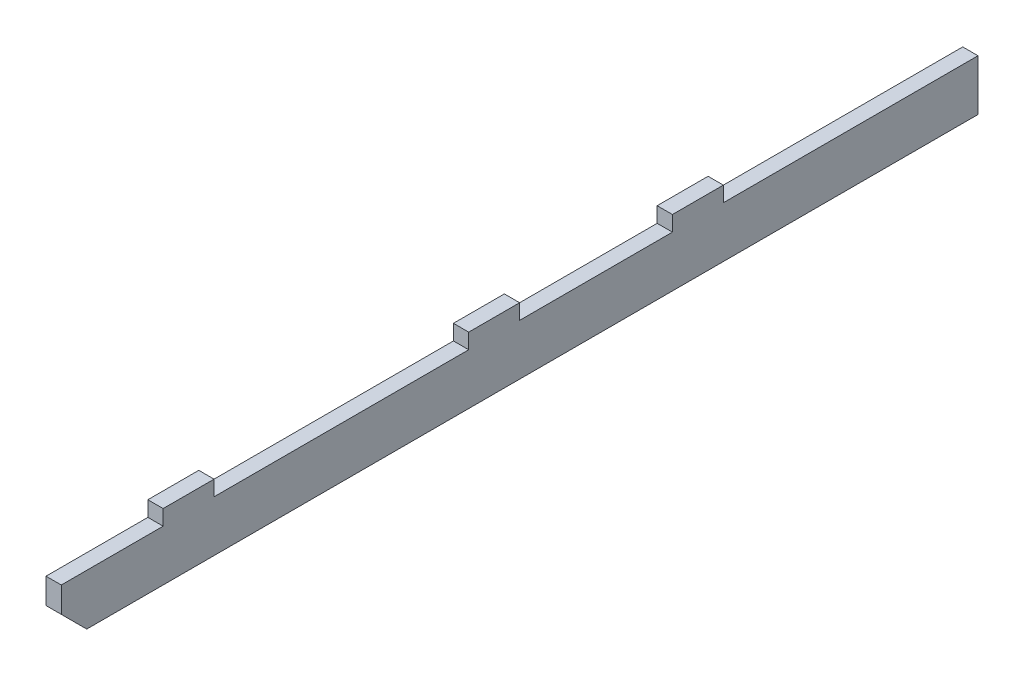
ISO-10303-21;
HEADER;
FILE_DESCRIPTION(('STEP AP214'),'2;1');
FILE_NAME('part.step','',(''),(''),'','','');
FILE_SCHEMA(('AUTOMOTIVE_DESIGN { 1 0 10303 214 1 1 1 1 }'));
ENDSEC;
DATA;
#1=APPLICATION_CONTEXT('core data for automotive mechanical design processes');
#2=APPLICATION_PROTOCOL_DEFINITION('international standard','automotive_design',2000,#1);
#3=PRODUCT_CONTEXT('',#1,'mechanical');
#4=PRODUCT('Part','Part','',(#3));
#5=PRODUCT_RELATED_PRODUCT_CATEGORY('part','',(#4));
#6=PRODUCT_DEFINITION_FORMATION('','',#4);
#7=PRODUCT_DEFINITION_CONTEXT('part definition',#1,'design');
#8=PRODUCT_DEFINITION('design','',#6,#7);
#9=PRODUCT_DEFINITION_SHAPE('','',#8);
#10=(LENGTH_UNIT() NAMED_UNIT(*) SI_UNIT(.MILLI.,.METRE.));
#11=(NAMED_UNIT(*) PLANE_ANGLE_UNIT() SI_UNIT($,.RADIAN.));
#12=(NAMED_UNIT(*) SI_UNIT($,.STERADIAN.) SOLID_ANGLE_UNIT());
#13=UNCERTAINTY_MEASURE_WITH_UNIT(LENGTH_MEASURE(1.E-05),#10,'distance_accuracy_value','');
#14=(GEOMETRIC_REPRESENTATION_CONTEXT(3) GLOBAL_UNCERTAINTY_ASSIGNED_CONTEXT((#13)) GLOBAL_UNIT_ASSIGNED_CONTEXT((#10,
#11,#12)) REPRESENTATION_CONTEXT('',''));
#15=CARTESIAN_POINT('',(0.,0.,0.));
#16=DIRECTION('',(0.,0.,1.));
#17=DIRECTION('',(1.,0.,0.));
#18=AXIS2_PLACEMENT_3D('',#15,#16,#17);
#19=CARTESIAN_POINT('',(3.,5.,-90.));
#20=DIRECTION('',(0.,0.,1.));
#21=DIRECTION('',(1.,0.,0.));
#22=AXIS2_PLACEMENT_3D('',#19,#20,#21);
#23=PLANE('',#22);
#24=DIRECTION('',(0.,1.,0.));
#25=VECTOR('',#24,1.);
#26=CARTESIAN_POINT('',(0.,5.,-90.));
#27=LINE('',#26,#25);
#28=CARTESIAN_POINT('',(0.,-5.,-90.));
#29=VERTEX_POINT('',#28);
#30=CARTESIAN_POINT('',(0.,5.,-90.));
#31=VERTEX_POINT('',#30);
#32=EDGE_CURVE('E180',#29,#31,#27,.T.);
#33=ORIENTED_EDGE('',*,*,#32,.T.);
#34=DIRECTION('',(-1.,0.,0.));
#35=VECTOR('',#34,1.);
#36=CARTESIAN_POINT('',(3.,5.,-90.));
#37=LINE('',#36,#35);
#38=CARTESIAN_POINT('',(3.,5.,-90.));
#39=VERTEX_POINT('',#38);
#40=EDGE_CURVE('E161',#39,#31,#37,.T.);
#41=ORIENTED_EDGE('',*,*,#40,.F.);
#42=DIRECTION('',(0.,1.,0.));
#43=VECTOR('',#42,1.);
#44=CARTESIAN_POINT('',(3.,5.,-90.));
#45=LINE('',#44,#43);
#46=CARTESIAN_POINT('',(3.,-5.,-90.));
#47=VERTEX_POINT('',#46);
#48=EDGE_CURVE('E168',#47,#39,#45,.T.);
#49=ORIENTED_EDGE('',*,*,#48,.F.);
#50=DIRECTION('',(-1.,0.,0.));
#51=VECTOR('',#50,1.);
#52=CARTESIAN_POINT('',(3.,-5.,-90.));
#53=LINE('',#52,#51);
#54=EDGE_CURVE('E224',#47,#29,#53,.T.);
#55=ORIENTED_EDGE('',*,*,#54,.T.);
#56=EDGE_LOOP('',(#33,#41,#49,#55));
#57=FACE_BOUND('',#56,.T.);
#58=ADVANCED_FACE('F38',(#57),#23,.F.);
#59=CARTESIAN_POINT('',(3.,5.,-40.));
#60=DIRECTION('',(0.,-1.,0.));
#61=DIRECTION('',(0.,0.,-1.));
#62=AXIS2_PLACEMENT_3D('',#59,#60,#61);
#63=PLANE('',#62);
#64=DIRECTION('',(0.,0.,1.));
#65=VECTOR('',#64,1.);
#66=CARTESIAN_POINT('',(0.,5.,-40.));
#67=LINE('',#66,#65);
#68=CARTESIAN_POINT('',(0.,5.,-40.));
#69=VERTEX_POINT('',#68);
#70=EDGE_CURVE('E253',#31,#69,#67,.T.);
#71=ORIENTED_EDGE('',*,*,#70,.T.);
#72=DIRECTION('',(-1.,0.,0.));
#73=VECTOR('',#72,1.);
#74=CARTESIAN_POINT('',(3.,5.,-40.));
#75=LINE('',#74,#73);
#76=CARTESIAN_POINT('',(3.,5.,-40.));
#77=VERTEX_POINT('',#76);
#78=EDGE_CURVE('E164',#77,#69,#75,.T.);
#79=ORIENTED_EDGE('',*,*,#78,.F.);
#80=DIRECTION('',(0.,0.,1.));
#81=VECTOR('',#80,1.);
#82=CARTESIAN_POINT('',(3.,5.,-40.));
#83=LINE('',#82,#81);
#84=EDGE_CURVE('E157',#39,#77,#83,.T.);
#85=ORIENTED_EDGE('',*,*,#84,.F.);
#86=ORIENTED_EDGE('',*,*,#40,.T.);
#87=EDGE_LOOP('',(#71,#79,#85,#86));
#88=FACE_BOUND('',#87,.T.);
#89=ADVANCED_FACE('F159',(#88),#63,.F.);
#90=CARTESIAN_POINT('',(3.,5.,-40.));
#91=DIRECTION('',(0.,0.,1.));
#92=DIRECTION('',(1.,0.,0.));
#93=AXIS2_PLACEMENT_3D('',#90,#91,#92);
#94=PLANE('',#93);
#95=DIRECTION('',(0.,1.,0.));
#96=VECTOR('',#95,1.);
#97=CARTESIAN_POINT('',(0.,5.,-40.));
#98=LINE('',#97,#96);
#99=CARTESIAN_POINT('',(0.,8.,-40.));
#100=VERTEX_POINT('',#99);
#101=EDGE_CURVE('E251',#69,#100,#98,.T.);
#102=ORIENTED_EDGE('',*,*,#101,.T.);
#103=DIRECTION('',(-1.,0.,0.));
#104=VECTOR('',#103,1.);
#105=CARTESIAN_POINT('',(3.,8.,-40.));
#106=LINE('',#105,#104);
#107=CARTESIAN_POINT('',(3.,8.,-40.));
#108=VERTEX_POINT('',#107);
#109=EDGE_CURVE('E185',#108,#100,#106,.T.);
#110=ORIENTED_EDGE('',*,*,#109,.F.);
#111=DIRECTION('',(0.,1.,0.));
#112=VECTOR('',#111,1.);
#113=CARTESIAN_POINT('',(3.,5.,-40.));
#114=LINE('',#113,#112);
#115=EDGE_CURVE('E167',#77,#108,#114,.T.);
#116=ORIENTED_EDGE('',*,*,#115,.F.);
#117=ORIENTED_EDGE('',*,*,#78,.T.);
#118=EDGE_LOOP('',(#102,#110,#116,#117));
#119=FACE_BOUND('',#118,.T.);
#120=ADVANCED_FACE('F285',(#119),#94,.F.);
#121=CARTESIAN_POINT('',(3.,8.,-40.));
#122=DIRECTION('',(0.,-1.,0.));
#123=DIRECTION('',(0.,0.,-1.));
#124=AXIS2_PLACEMENT_3D('',#121,#122,#123);
#125=PLANE('',#124);
#126=DIRECTION('',(0.,0.,1.));
#127=VECTOR('',#126,1.);
#128=CARTESIAN_POINT('',(0.,8.,-40.));
#129=LINE('',#128,#127);
#130=CARTESIAN_POINT('',(0.,8.,-30.));
#131=VERTEX_POINT('',#130);
#132=EDGE_CURVE('E249',#100,#131,#129,.T.);
#133=ORIENTED_EDGE('',*,*,#132,.T.);
#134=DIRECTION('',(-1.,0.,0.));
#135=VECTOR('',#134,1.);
#136=CARTESIAN_POINT('',(3.,8.,-30.));
#137=LINE('',#136,#135);
#138=CARTESIAN_POINT('',(3.,8.,-30.));
#139=VERTEX_POINT('',#138);
#140=EDGE_CURVE('E191',#139,#131,#137,.T.);
#141=ORIENTED_EDGE('',*,*,#140,.F.);
#142=DIRECTION('',(0.,0.,1.));
#143=VECTOR('',#142,1.);
#144=CARTESIAN_POINT('',(3.,8.,-40.));
#145=LINE('',#144,#143);
#146=EDGE_CURVE('E279',#108,#139,#145,.T.);
#147=ORIENTED_EDGE('',*,*,#146,.F.);
#148=ORIENTED_EDGE('',*,*,#109,.T.);
#149=EDGE_LOOP('',(#133,#141,#147,#148));
#150=FACE_BOUND('',#149,.T.);
#151=ADVANCED_FACE('F289',(#150),#125,.F.);
#152=CARTESIAN_POINT('',(3.,5.,-30.));
#153=DIRECTION('',(0.,0.,-1.));
#154=DIRECTION('',(-1.,0.,0.));
#155=AXIS2_PLACEMENT_3D('',#152,#153,#154);
#156=PLANE('',#155);
#157=DIRECTION('',(0.,-1.,0.));
#158=VECTOR('',#157,1.);
#159=CARTESIAN_POINT('',(0.,5.,-30.));
#160=LINE('',#159,#158);
#161=CARTESIAN_POINT('',(0.,5.,-30.));
#162=VERTEX_POINT('',#161);
#163=EDGE_CURVE('E247',#131,#162,#160,.T.);
#164=ORIENTED_EDGE('',*,*,#163,.T.);
#165=DIRECTION('',(-1.,0.,0.));
#166=VECTOR('',#165,1.);
#167=CARTESIAN_POINT('',(3.,5.,-30.));
#168=LINE('',#167,#166);
#169=CARTESIAN_POINT('',(3.,5.,-30.));
#170=VERTEX_POINT('',#169);
#171=EDGE_CURVE('E194',#170,#162,#168,.T.);
#172=ORIENTED_EDGE('',*,*,#171,.F.);
#173=DIRECTION('',(0.,-1.,0.));
#174=VECTOR('',#173,1.);
#175=CARTESIAN_POINT('',(3.,5.,-30.));
#176=LINE('',#175,#174);
#177=EDGE_CURVE('E277',#139,#170,#176,.T.);
#178=ORIENTED_EDGE('',*,*,#177,.F.);
#179=ORIENTED_EDGE('',*,*,#140,.T.);
#180=EDGE_LOOP('',(#164,#172,#178,#179));
#181=FACE_BOUND('',#180,.T.);
#182=ADVANCED_FACE('F294',(#181),#156,.F.);
#183=CARTESIAN_POINT('',(3.,5.,0.));
#184=DIRECTION('',(0.,-1.,0.));
#185=DIRECTION('',(0.,0.,-1.));
#186=AXIS2_PLACEMENT_3D('',#183,#184,#185);
#187=PLANE('',#186);
#188=DIRECTION('',(0.,0.,1.));
#189=VECTOR('',#188,1.);
#190=CARTESIAN_POINT('',(0.,5.,0.));
#191=LINE('',#190,#189);
#192=CARTESIAN_POINT('',(0.,5.,0.));
#193=VERTEX_POINT('',#192);
#194=EDGE_CURVE('E245',#162,#193,#191,.T.);
#195=ORIENTED_EDGE('',*,*,#194,.T.);
#196=DIRECTION('',(-1.,0.,0.));
#197=VECTOR('',#196,1.);
#198=CARTESIAN_POINT('',(3.,5.,0.));
#199=LINE('',#198,#197);
#200=CARTESIAN_POINT('',(3.,5.,0.));
#201=VERTEX_POINT('',#200);
#202=EDGE_CURVE('E197',#201,#193,#199,.T.);
#203=ORIENTED_EDGE('',*,*,#202,.F.);
#204=DIRECTION('',(0.,0.,1.));
#205=VECTOR('',#204,1.);
#206=CARTESIAN_POINT('',(3.,5.,0.));
#207=LINE('',#206,#205);
#208=EDGE_CURVE('E275',#170,#201,#207,.T.);
#209=ORIENTED_EDGE('',*,*,#208,.F.);
#210=ORIENTED_EDGE('',*,*,#171,.T.);
#211=EDGE_LOOP('',(#195,#203,#209,#210));
#212=FACE_BOUND('',#211,.T.);
#213=ADVANCED_FACE('F300',(#212),#187,.F.);
#214=CARTESIAN_POINT('',(3.,5.,0.));
#215=DIRECTION('',(0.,0.,1.));
#216=DIRECTION('',(1.,0.,0.));
#217=AXIS2_PLACEMENT_3D('',#214,#215,#216);
#218=PLANE('',#217);
#219=DIRECTION('',(0.,1.,0.));
#220=VECTOR('',#219,1.);
#221=CARTESIAN_POINT('',(0.,5.,0.));
#222=LINE('',#221,#220);
#223=CARTESIAN_POINT('',(0.,8.,0.));
#224=VERTEX_POINT('',#223);
#225=EDGE_CURVE('E243',#193,#224,#222,.T.);
#226=ORIENTED_EDGE('',*,*,#225,.T.);
#227=DIRECTION('',(-1.,0.,0.));
#228=VECTOR('',#227,1.);
#229=CARTESIAN_POINT('',(3.,8.,0.));
#230=LINE('',#229,#228);
#231=CARTESIAN_POINT('',(3.,8.,0.));
#232=VERTEX_POINT('',#231);
#233=EDGE_CURVE('E200',#232,#224,#230,.T.);
#234=ORIENTED_EDGE('',*,*,#233,.F.);
#235=DIRECTION('',(0.,1.,0.));
#236=VECTOR('',#235,1.);
#237=CARTESIAN_POINT('',(3.,5.,0.));
#238=LINE('',#237,#236);
#239=EDGE_CURVE('E273',#201,#232,#238,.T.);
#240=ORIENTED_EDGE('',*,*,#239,.F.);
#241=ORIENTED_EDGE('',*,*,#202,.T.);
#242=EDGE_LOOP('',(#226,#234,#240,#241));
#243=FACE_BOUND('',#242,.T.);
#244=ADVANCED_FACE('F304',(#243),#218,.F.);
#245=CARTESIAN_POINT('',(3.,8.,0.));
#246=DIRECTION('',(0.,-1.,0.));
#247=DIRECTION('',(0.,0.,-1.));
#248=AXIS2_PLACEMENT_3D('',#245,#246,#247);
#249=PLANE('',#248);
#250=DIRECTION('',(0.,0.,1.));
#251=VECTOR('',#250,1.);
#252=CARTESIAN_POINT('',(0.,8.,0.));
#253=LINE('',#252,#251);
#254=CARTESIAN_POINT('',(0.,8.,10.));
#255=VERTEX_POINT('',#254);
#256=EDGE_CURVE('E241',#224,#255,#253,.T.);
#257=ORIENTED_EDGE('',*,*,#256,.T.);
#258=DIRECTION('',(-1.,0.,0.));
#259=VECTOR('',#258,1.);
#260=CARTESIAN_POINT('',(3.,8.,10.));
#261=LINE('',#260,#259);
#262=CARTESIAN_POINT('',(3.,8.,10.));
#263=VERTEX_POINT('',#262);
#264=EDGE_CURVE('E203',#263,#255,#261,.T.);
#265=ORIENTED_EDGE('',*,*,#264,.F.);
#266=DIRECTION('',(0.,0.,1.));
#267=VECTOR('',#266,1.);
#268=CARTESIAN_POINT('',(3.,8.,0.));
#269=LINE('',#268,#267);
#270=EDGE_CURVE('E271',#232,#263,#269,.T.);
#271=ORIENTED_EDGE('',*,*,#270,.F.);
#272=ORIENTED_EDGE('',*,*,#233,.T.);
#273=EDGE_LOOP('',(#257,#265,#271,#272));
#274=FACE_BOUND('',#273,.T.);
#275=ADVANCED_FACE('F309',(#274),#249,.F.);
#276=CARTESIAN_POINT('',(3.,5.,10.));
#277=DIRECTION('',(0.,0.,-1.));
#278=DIRECTION('',(0.,1.,0.));
#279=AXIS2_PLACEMENT_3D('',#276,#277,#278);
#280=PLANE('',#279);
#281=DIRECTION('',(0.,-1.,0.));
#282=VECTOR('',#281,1.);
#283=CARTESIAN_POINT('',(0.,5.,10.));
#284=LINE('',#283,#282);
#285=CARTESIAN_POINT('',(0.,5.,10.));
#286=VERTEX_POINT('',#285);
#287=EDGE_CURVE('E239',#255,#286,#284,.T.);
#288=ORIENTED_EDGE('',*,*,#287,.T.);
#289=DIRECTION('',(-1.,0.,0.));
#290=VECTOR('',#289,1.);
#291=CARTESIAN_POINT('',(3.,5.,10.));
#292=LINE('',#291,#290);
#293=CARTESIAN_POINT('',(3.,5.,10.));
#294=VERTEX_POINT('',#293);
#295=EDGE_CURVE('E206',#294,#286,#292,.T.);
#296=ORIENTED_EDGE('',*,*,#295,.F.);
#297=DIRECTION('',(0.,-1.,0.));
#298=VECTOR('',#297,1.);
#299=CARTESIAN_POINT('',(3.,5.,10.));
#300=LINE('',#299,#298);
#301=EDGE_CURVE('E269',#263,#294,#300,.T.);
#302=ORIENTED_EDGE('',*,*,#301,.F.);
#303=ORIENTED_EDGE('',*,*,#264,.T.);
#304=EDGE_LOOP('',(#288,#296,#302,#303));
#305=FACE_BOUND('',#304,.T.);
#306=ADVANCED_FACE('F315',(#305),#280,.F.);
#307=CARTESIAN_POINT('',(3.,5.,60.));
#308=DIRECTION('',(0.,-1.,0.));
#309=DIRECTION('',(0.,0.,-1.));
#310=AXIS2_PLACEMENT_3D('',#307,#308,#309);
#311=PLANE('',#310);
#312=DIRECTION('',(0.,0.,1.));
#313=VECTOR('',#312,1.);
#314=CARTESIAN_POINT('',(0.,5.,60.));
#315=LINE('',#314,#313);
#316=CARTESIAN_POINT('',(0.,5.,60.));
#317=VERTEX_POINT('',#316);
#318=EDGE_CURVE('E237',#286,#317,#315,.T.);
#319=ORIENTED_EDGE('',*,*,#318,.T.);
#320=DIRECTION('',(-1.,0.,0.));
#321=VECTOR('',#320,1.);
#322=CARTESIAN_POINT('',(3.,5.,60.));
#323=LINE('',#322,#321);
#324=CARTESIAN_POINT('',(3.,5.,60.));
#325=VERTEX_POINT('',#324);
#326=EDGE_CURVE('E209',#325,#317,#323,.T.);
#327=ORIENTED_EDGE('',*,*,#326,.F.);
#328=DIRECTION('',(0.,0.,1.));
#329=VECTOR('',#328,1.);
#330=CARTESIAN_POINT('',(3.,5.,60.));
#331=LINE('',#330,#329);
#332=EDGE_CURVE('E267',#294,#325,#331,.T.);
#333=ORIENTED_EDGE('',*,*,#332,.F.);
#334=ORIENTED_EDGE('',*,*,#295,.T.);
#335=EDGE_LOOP('',(#319,#327,#333,#334));
#336=FACE_BOUND('',#335,.T.);
#337=ADVANCED_FACE('F319',(#336),#311,.F.);
#338=CARTESIAN_POINT('',(3.,5.,60.));
#339=DIRECTION('',(0.,0.,1.));
#340=DIRECTION('',(1.,0.,0.));
#341=AXIS2_PLACEMENT_3D('',#338,#339,#340);
#342=PLANE('',#341);
#343=DIRECTION('',(0.,1.,0.));
#344=VECTOR('',#343,1.);
#345=CARTESIAN_POINT('',(0.,5.,60.));
#346=LINE('',#345,#344);
#347=CARTESIAN_POINT('',(0.,8.,60.));
#348=VERTEX_POINT('',#347);
#349=EDGE_CURVE('E235',#317,#348,#346,.T.);
#350=ORIENTED_EDGE('',*,*,#349,.T.);
#351=DIRECTION('',(-1.,0.,0.));
#352=VECTOR('',#351,1.);
#353=CARTESIAN_POINT('',(3.,8.,60.));
#354=LINE('',#353,#352);
#355=CARTESIAN_POINT('',(3.,8.,60.));
#356=VERTEX_POINT('',#355);
#357=EDGE_CURVE('E212',#356,#348,#354,.T.);
#358=ORIENTED_EDGE('',*,*,#357,.F.);
#359=DIRECTION('',(0.,1.,0.));
#360=VECTOR('',#359,1.);
#361=CARTESIAN_POINT('',(3.,5.,60.));
#362=LINE('',#361,#360);
#363=EDGE_CURVE('E265',#325,#356,#362,.T.);
#364=ORIENTED_EDGE('',*,*,#363,.F.);
#365=ORIENTED_EDGE('',*,*,#326,.T.);
#366=EDGE_LOOP('',(#350,#358,#364,#365));
#367=FACE_BOUND('',#366,.T.);
#368=ADVANCED_FACE('F324',(#367),#342,.F.);
#369=CARTESIAN_POINT('',(3.,8.,60.));
#370=DIRECTION('',(0.,-1.,0.));
#371=DIRECTION('',(0.,0.,-1.));
#372=AXIS2_PLACEMENT_3D('',#369,#370,#371);
#373=PLANE('',#372);
#374=DIRECTION('',(0.,0.,1.));
#375=VECTOR('',#374,1.);
#376=CARTESIAN_POINT('',(0.,8.,60.));
#377=LINE('',#376,#375);
#378=CARTESIAN_POINT('',(0.,8.,70.));
#379=VERTEX_POINT('',#378);
#380=EDGE_CURVE('E233',#348,#379,#377,.T.);
#381=ORIENTED_EDGE('',*,*,#380,.T.);
#382=DIRECTION('',(-1.,0.,0.));
#383=VECTOR('',#382,1.);
#384=CARTESIAN_POINT('',(3.,8.,70.));
#385=LINE('',#384,#383);
#386=CARTESIAN_POINT('',(3.,8.,70.));
#387=VERTEX_POINT('',#386);
#388=EDGE_CURVE('E215',#387,#379,#385,.T.);
#389=ORIENTED_EDGE('',*,*,#388,.F.);
#390=DIRECTION('',(0.,0.,1.));
#391=VECTOR('',#390,1.);
#392=CARTESIAN_POINT('',(3.,8.,60.));
#393=LINE('',#392,#391);
#394=EDGE_CURVE('E263',#356,#387,#393,.T.);
#395=ORIENTED_EDGE('',*,*,#394,.F.);
#396=ORIENTED_EDGE('',*,*,#357,.T.);
#397=EDGE_LOOP('',(#381,#389,#395,#396));
#398=FACE_BOUND('',#397,.T.);
#399=ADVANCED_FACE('F330',(#398),#373,.F.);
#400=CARTESIAN_POINT('',(3.,5.,70.));
#401=DIRECTION('',(0.,0.,-1.));
#402=DIRECTION('',(-1.,0.,0.));
#403=AXIS2_PLACEMENT_3D('',#400,#401,#402);
#404=PLANE('',#403);
#405=DIRECTION('',(0.,-1.,0.));
#406=VECTOR('',#405,1.);
#407=CARTESIAN_POINT('',(0.,5.,70.));
#408=LINE('',#407,#406);
#409=CARTESIAN_POINT('',(0.,5.,70.));
#410=VERTEX_POINT('',#409);
#411=EDGE_CURVE('E231',#379,#410,#408,.T.);
#412=ORIENTED_EDGE('',*,*,#411,.T.);
#413=DIRECTION('',(-1.,0.,0.));
#414=VECTOR('',#413,1.);
#415=CARTESIAN_POINT('',(3.,5.,70.));
#416=LINE('',#415,#414);
#417=CARTESIAN_POINT('',(3.,5.,70.));
#418=VERTEX_POINT('',#417);
#419=EDGE_CURVE('E218',#418,#410,#416,.T.);
#420=ORIENTED_EDGE('',*,*,#419,.F.);
#421=DIRECTION('',(0.,-1.,0.));
#422=VECTOR('',#421,1.);
#423=CARTESIAN_POINT('',(3.,5.,70.));
#424=LINE('',#423,#422);
#425=EDGE_CURVE('E261',#387,#418,#424,.T.);
#426=ORIENTED_EDGE('',*,*,#425,.F.);
#427=ORIENTED_EDGE('',*,*,#388,.T.);
#428=EDGE_LOOP('',(#412,#420,#426,#427));
#429=FACE_BOUND('',#428,.T.);
#430=ADVANCED_FACE('F334',(#429),#404,.F.);
#431=CARTESIAN_POINT('',(3.,5.,90.));
#432=DIRECTION('',(0.,-1.,0.));
#433=DIRECTION('',(0.,0.,-1.));
#434=AXIS2_PLACEMENT_3D('',#431,#432,#433);
#435=PLANE('',#434);
#436=DIRECTION('',(0.,0.,1.));
#437=VECTOR('',#436,1.);
#438=CARTESIAN_POINT('',(0.,5.,90.));
#439=LINE('',#438,#437);
#440=CARTESIAN_POINT('',(0.,5.,90.));
#441=VERTEX_POINT('',#440);
#442=EDGE_CURVE('E229',#410,#441,#439,.T.);
#443=ORIENTED_EDGE('',*,*,#442,.T.);
#444=DIRECTION('',(-1.,0.,0.));
#445=VECTOR('',#444,1.);
#446=CARTESIAN_POINT('',(3.,5.,90.));
#447=LINE('',#446,#445);
#448=CARTESIAN_POINT('',(3.,5.,90.));
#449=VERTEX_POINT('',#448);
#450=EDGE_CURVE('E221',#449,#441,#447,.T.);
#451=ORIENTED_EDGE('',*,*,#450,.F.);
#452=DIRECTION('',(0.,0.,1.));
#453=VECTOR('',#452,1.);
#454=CARTESIAN_POINT('',(3.,5.,90.));
#455=LINE('',#454,#453);
#456=EDGE_CURVE('E259',#418,#449,#455,.T.);
#457=ORIENTED_EDGE('',*,*,#456,.F.);
#458=ORIENTED_EDGE('',*,*,#419,.T.);
#459=EDGE_LOOP('',(#443,#451,#457,#458));
#460=FACE_BOUND('',#459,.T.);
#461=ADVANCED_FACE('F339',(#460),#435,.F.);
#462=CARTESIAN_POINT('',(3.,5.,90.));
#463=DIRECTION('',(0.,0.,-1.));
#464=DIRECTION('',(-1.,0.,0.));
#465=AXIS2_PLACEMENT_3D('',#462,#463,#464);
#466=PLANE('',#465);
#467=DIRECTION('',(0.,-1.,0.));
#468=VECTOR('',#467,1.);
#469=CARTESIAN_POINT('',(0.,5.,90.));
#470=LINE('',#469,#468);
#471=CARTESIAN_POINT('',(0.,0.,90.));
#472=VERTEX_POINT('',#471);
#473=EDGE_CURVE('E227',#441,#472,#470,.T.);
#474=ORIENTED_EDGE('',*,*,#473,.T.);
#475=DIRECTION('',(1.,0.,0.));
#476=VECTOR('',#475,1.);
#477=CARTESIAN_POINT('',(3.,0.,90.));
#478=LINE('',#477,#476);
#479=CARTESIAN_POINT('',(3.,0.,90.));
#480=VERTEX_POINT('',#479);
#481=EDGE_CURVE('E46',#472,#480,#478,.T.);
#482=ORIENTED_EDGE('',*,*,#481,.T.);
#483=DIRECTION('',(0.,-1.,0.));
#484=VECTOR('',#483,1.);
#485=CARTESIAN_POINT('',(3.,5.,90.));
#486=LINE('',#485,#484);
#487=EDGE_CURVE('E257',#449,#480,#486,.T.);
#488=ORIENTED_EDGE('',*,*,#487,.F.);
#489=ORIENTED_EDGE('',*,*,#450,.T.);
#490=EDGE_LOOP('',(#474,#482,#488,#489));
#491=FACE_BOUND('',#490,.T.);
#492=ADVANCED_FACE('F346',(#491),#466,.F.);
#493=CARTESIAN_POINT('',(3.,-5.,90.));
#494=DIRECTION('',(0.,1.,0.));
#495=DIRECTION('',(0.,0.,1.));
#496=AXIS2_PLACEMENT_3D('',#493,#494,#495);
#497=PLANE('',#496);
#498=DIRECTION('',(0.,0.,-1.));
#499=VECTOR('',#498,1.);
#500=CARTESIAN_POINT('',(3.,-5.,90.));
#501=LINE('',#500,#499);
#502=CARTESIAN_POINT('',(3.,-5.,85.));
#503=VERTEX_POINT('',#502);
#504=EDGE_CURVE('E173',#503,#47,#501,.T.);
#505=ORIENTED_EDGE('',*,*,#504,.F.);
#506=DIRECTION('',(-1.,0.,0.));
#507=VECTOR('',#506,1.);
#508=CARTESIAN_POINT('',(3.,-5.,85.));
#509=LINE('',#508,#507);
#510=CARTESIAN_POINT('',(0.,-5.,85.));
#511=VERTEX_POINT('',#510);
#512=EDGE_CURVE('E181',#503,#511,#509,.T.);
#513=ORIENTED_EDGE('',*,*,#512,.T.);
#514=DIRECTION('',(0.,0.,-1.));
#515=VECTOR('',#514,1.);
#516=CARTESIAN_POINT('',(0.,-5.,90.));
#517=LINE('',#516,#515);
#518=EDGE_CURVE('E177',#511,#29,#517,.T.);
#519=ORIENTED_EDGE('',*,*,#518,.T.);
#520=ORIENTED_EDGE('',*,*,#54,.F.);
#521=EDGE_LOOP('',(#505,#513,#519,#520));
#522=FACE_BOUND('',#521,.T.);
#523=ADVANCED_FACE('F344',(#522),#497,.F.);
#524=CARTESIAN_POINT('',(3.,0.,0.));
#525=DIRECTION('',(1.,0.,0.));
#526=DIRECTION('',(0.,0.,-1.));
#527=AXIS2_PLACEMENT_3D('',#524,#525,#526);
#528=PLANE('',#527);
#529=ORIENTED_EDGE('',*,*,#487,.T.);
#530=DIRECTION('',(0.,0.707106781186549,0.707106781186546));
#531=VECTOR('',#530,1.);
#532=CARTESIAN_POINT('',(3.,-45.,45.0000000000002));
#533=LINE('',#532,#531);
#534=EDGE_CURVE('E11',#480,#503,#533,.F.);
#535=ORIENTED_EDGE('',*,*,#534,.T.);
#536=ORIENTED_EDGE('',*,*,#504,.T.);
#537=ORIENTED_EDGE('',*,*,#48,.T.);
#538=ORIENTED_EDGE('',*,*,#84,.T.);
#539=ORIENTED_EDGE('',*,*,#115,.T.);
#540=ORIENTED_EDGE('',*,*,#146,.T.);
#541=ORIENTED_EDGE('',*,*,#177,.T.);
#542=ORIENTED_EDGE('',*,*,#208,.T.);
#543=ORIENTED_EDGE('',*,*,#239,.T.);
#544=ORIENTED_EDGE('',*,*,#270,.T.);
#545=ORIENTED_EDGE('',*,*,#301,.T.);
#546=ORIENTED_EDGE('',*,*,#332,.T.);
#547=ORIENTED_EDGE('',*,*,#363,.T.);
#548=ORIENTED_EDGE('',*,*,#394,.T.);
#549=ORIENTED_EDGE('',*,*,#425,.T.);
#550=ORIENTED_EDGE('',*,*,#456,.T.);
#551=EDGE_LOOP('',(#529,#535,#536,#537,#538,#539,#540,#541,#542,#543,#544,#545,#546,#547,#548,
#549,#550));
#552=FACE_BOUND('',#551,.T.);
#553=ADVANCED_FACE('F171',(#552),#528,.T.);
#554=CARTESIAN_POINT('',(0.,0.,0.));
#555=DIRECTION('',(1.,0.,0.));
#556=DIRECTION('',(0.,0.,-1.));
#557=AXIS2_PLACEMENT_3D('',#554,#555,#556);
#558=PLANE('',#557);
#559=ORIENTED_EDGE('',*,*,#518,.F.);
#560=DIRECTION('',(0.,-0.707106781186549,-0.707106781186546));
#561=VECTOR('',#560,1.);
#562=CARTESIAN_POINT('',(0.,-5.,85.));
#563=LINE('',#562,#561);
#564=EDGE_CURVE('E60',#511,#472,#563,.F.);
#565=ORIENTED_EDGE('',*,*,#564,.T.);
#566=ORIENTED_EDGE('',*,*,#473,.F.);
#567=ORIENTED_EDGE('',*,*,#442,.F.);
#568=ORIENTED_EDGE('',*,*,#411,.F.);
#569=ORIENTED_EDGE('',*,*,#380,.F.);
#570=ORIENTED_EDGE('',*,*,#349,.F.);
#571=ORIENTED_EDGE('',*,*,#318,.F.);
#572=ORIENTED_EDGE('',*,*,#287,.F.);
#573=ORIENTED_EDGE('',*,*,#256,.F.);
#574=ORIENTED_EDGE('',*,*,#225,.F.);
#575=ORIENTED_EDGE('',*,*,#194,.F.);
#576=ORIENTED_EDGE('',*,*,#163,.F.);
#577=ORIENTED_EDGE('',*,*,#132,.F.);
#578=ORIENTED_EDGE('',*,*,#101,.F.);
#579=ORIENTED_EDGE('',*,*,#70,.F.);
#580=ORIENTED_EDGE('',*,*,#32,.F.);
#581=EDGE_LOOP('',(#559,#565,#566,#567,#568,#569,#570,#571,#572,#573,#574,#575,#576,#577,#578,
#579,#580));
#582=FACE_BOUND('',#581,.T.);
#583=ADVANCED_FACE('F345',(#582),#558,.F.);
#584=CARTESIAN_POINT('',(3.,-5.,85.));
#585=DIRECTION('',(0.,0.707106781186545,-0.707106781186549));
#586=DIRECTION('',(-1.,0.,0.));
#587=AXIS2_PLACEMENT_3D('',#584,#585,#586);
#588=PLANE('',#587);
#589=ORIENTED_EDGE('',*,*,#534,.F.);
#590=ORIENTED_EDGE('',*,*,#481,.F.);
#591=ORIENTED_EDGE('',*,*,#564,.F.);
#592=ORIENTED_EDGE('',*,*,#512,.F.);
#593=EDGE_LOOP('',(#589,#590,#591,#592));
#594=FACE_BOUND('',#593,.T.);
#595=ADVANCED_FACE('F40',(#594),#588,.F.);
#596=CLOSED_SHELL('',(#58,#89,#120,#151,#182,#213,#244,#275,#306,#337,#368,#399,#430,#461,#492,
#523,#553,#583,#595));
#597=MANIFOLD_SOLID_BREP('B2',#596);
#598=ADVANCED_BREP_SHAPE_REPRESENTATION('',(#18,#597),#14);
#599=SHAPE_DEFINITION_REPRESENTATION(#9,#598);
ENDSEC;
END-ISO-10303-21;
